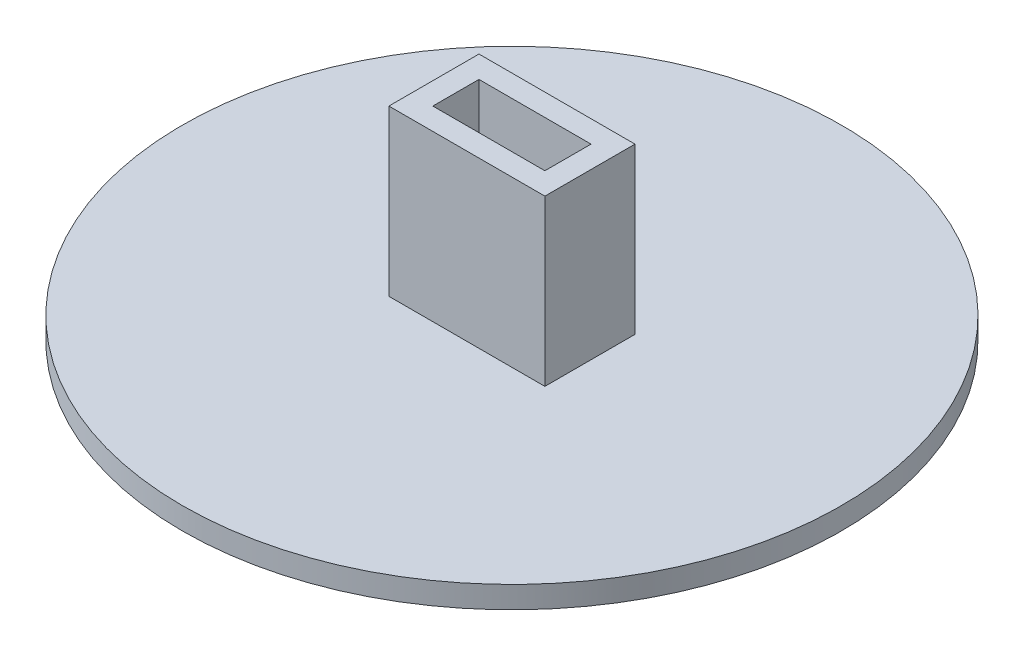
ISO-10303-21;
HEADER;
FILE_DESCRIPTION(('STEP AP214'),'2;1');
FILE_NAME('part.step','',(''),(''),'','','');
FILE_SCHEMA(('AUTOMOTIVE_DESIGN { 1 0 10303 214 1 1 1 1 }'));
ENDSEC;
DATA;
#1=APPLICATION_CONTEXT('core data for automotive mechanical design processes');
#2=APPLICATION_PROTOCOL_DEFINITION('international standard','automotive_design',2000,#1);
#3=PRODUCT_CONTEXT('',#1,'mechanical');
#4=PRODUCT('Part','Part','',(#3));
#5=PRODUCT_RELATED_PRODUCT_CATEGORY('part','',(#4));
#6=PRODUCT_DEFINITION_FORMATION('','',#4);
#7=PRODUCT_DEFINITION_CONTEXT('part definition',#1,'design');
#8=PRODUCT_DEFINITION('design','',#6,#7);
#9=PRODUCT_DEFINITION_SHAPE('','',#8);
#10=(LENGTH_UNIT() NAMED_UNIT(*) SI_UNIT(.MILLI.,.METRE.));
#11=(NAMED_UNIT(*) PLANE_ANGLE_UNIT() SI_UNIT($,.RADIAN.));
#12=(NAMED_UNIT(*) SI_UNIT($,.STERADIAN.) SOLID_ANGLE_UNIT());
#13=UNCERTAINTY_MEASURE_WITH_UNIT(LENGTH_MEASURE(1.E-05),#10,'distance_accuracy_value','');
#14=(GEOMETRIC_REPRESENTATION_CONTEXT(3) GLOBAL_UNCERTAINTY_ASSIGNED_CONTEXT((#13)) GLOBAL_UNIT_ASSIGNED_CONTEXT((#10,
#11,#12)) REPRESENTATION_CONTEXT('',''));
#15=CARTESIAN_POINT('',(0.,0.,0.));
#16=DIRECTION('',(0.,0.,1.));
#17=DIRECTION('',(1.,0.,0.));
#18=AXIS2_PLACEMENT_3D('',#15,#16,#17);
#19=CARTESIAN_POINT('',(0.,2.,0.));
#20=DIRECTION('',(0.,-1.,0.));
#21=DIRECTION('',(0.,0.,-1.));
#22=AXIS2_PLACEMENT_3D('',#19,#20,#21);
#23=CYLINDRICAL_SURFACE('',#22,30.);
#24=CARTESIAN_POINT('',(0.,2.,0.));
#25=DIRECTION('',(0.,1.,0.));
#26=DIRECTION('',(0.,0.,1.));
#27=AXIS2_PLACEMENT_3D('',#24,#25,#26);
#28=CIRCLE('',#27,30.);
#29=CARTESIAN_POINT('',(0.,2.,30.));
#30=VERTEX_POINT('',#29);
#31=EDGE_CURVE('E11',#30,#30,#28,.T.);
#32=ORIENTED_EDGE('',*,*,#31,.F.);
#33=EDGE_LOOP('',(#32));
#34=FACE_BOUND('',#33,.T.);
#35=CARTESIAN_POINT('',(0.,0.,0.));
#36=DIRECTION('',(0.,1.,0.));
#37=DIRECTION('',(0.,0.,1.));
#38=AXIS2_PLACEMENT_3D('',#35,#36,#37);
#39=CIRCLE('',#38,30.);
#40=CARTESIAN_POINT('',(0.,0.,30.));
#41=VERTEX_POINT('',#40);
#42=EDGE_CURVE('E35',#41,#41,#39,.T.);
#43=ORIENTED_EDGE('',*,*,#42,.T.);
#44=EDGE_LOOP('',(#43));
#45=FACE_BOUND('',#44,.T.);
#46=ADVANCED_FACE('F32',(#34,#45),#23,.T.);
#47=CARTESIAN_POINT('',(0.,2.,0.));
#48=DIRECTION('',(0.,1.,0.));
#49=DIRECTION('',(0.,0.,1.));
#50=AXIS2_PLACEMENT_3D('',#47,#48,#49);
#51=PLANE('',#50);
#52=DIRECTION('',(0.,0.,-1.));
#53=VECTOR('',#52,1.);
#54=CARTESIAN_POINT('',(7.1,2.,4.1));
#55=LINE('',#54,#53);
#56=CARTESIAN_POINT('',(7.1,2.,4.1));
#57=VERTEX_POINT('',#56);
#58=CARTESIAN_POINT('',(7.1,2.,-4.1));
#59=VERTEX_POINT('',#58);
#60=EDGE_CURVE('E46',#57,#59,#55,.T.);
#61=ORIENTED_EDGE('',*,*,#60,.F.);
#62=DIRECTION('',(1.,0.,0.));
#63=VECTOR('',#62,1.);
#64=CARTESIAN_POINT('',(-7.1,2.,4.1));
#65=LINE('',#64,#63);
#66=CARTESIAN_POINT('',(-7.1,2.,4.1));
#67=VERTEX_POINT('',#66);
#68=EDGE_CURVE('E50',#67,#57,#65,.T.);
#69=ORIENTED_EDGE('',*,*,#68,.F.);
#70=DIRECTION('',(0.,0.,1.));
#71=VECTOR('',#70,1.);
#72=CARTESIAN_POINT('',(-7.1,2.,4.1));
#73=LINE('',#72,#71);
#74=CARTESIAN_POINT('',(-7.1,2.,-4.1));
#75=VERTEX_POINT('',#74);
#76=EDGE_CURVE('E151',#75,#67,#73,.T.);
#77=ORIENTED_EDGE('',*,*,#76,.F.);
#78=DIRECTION('',(-1.,0.,0.));
#79=VECTOR('',#78,1.);
#80=CARTESIAN_POINT('',(-7.1,2.,-4.1));
#81=LINE('',#80,#79);
#82=EDGE_CURVE('E148',#59,#75,#81,.T.);
#83=ORIENTED_EDGE('',*,*,#82,.F.);
#84=EDGE_LOOP('',(#61,#69,#77,#83));
#85=FACE_BOUND('',#84,.T.);
#86=ORIENTED_EDGE('',*,*,#31,.T.);
#87=EDGE_LOOP('',(#86));
#88=FACE_BOUND('',#87,.T.);
#89=ADVANCED_FACE('F172',(#85,#88),#51,.T.);
#90=CARTESIAN_POINT('',(0.,0.,0.));
#91=DIRECTION('',(0.,1.,0.));
#92=DIRECTION('',(0.,0.,1.));
#93=AXIS2_PLACEMENT_3D('',#90,#91,#92);
#94=PLANE('',#93);
#95=ORIENTED_EDGE('',*,*,#42,.F.);
#96=EDGE_LOOP('',(#95));
#97=FACE_BOUND('',#96,.T.);
#98=ADVANCED_FACE('F170',(#97),#94,.F.);
#99=CARTESIAN_POINT('',(0.,17.,0.));
#100=DIRECTION('',(0.,-1.,0.));
#101=DIRECTION('',(0.,0.,-1.));
#102=AXIS2_PLACEMENT_3D('',#99,#100,#101);
#103=PLANE('',#102);
#104=DIRECTION('',(0.,0.,-1.));
#105=VECTOR('',#104,1.);
#106=CARTESIAN_POINT('',(7.1,17.,4.1));
#107=LINE('',#106,#105);
#108=CARTESIAN_POINT('',(7.1,17.,4.1));
#109=VERTEX_POINT('',#108);
#110=CARTESIAN_POINT('',(7.1,17.,-4.1));
#111=VERTEX_POINT('',#110);
#112=EDGE_CURVE('E137',#109,#111,#107,.T.);
#113=ORIENTED_EDGE('',*,*,#112,.T.);
#114=DIRECTION('',(-1.,0.,0.));
#115=VECTOR('',#114,1.);
#116=CARTESIAN_POINT('',(-7.1,17.,-4.1));
#117=LINE('',#116,#115);
#118=CARTESIAN_POINT('',(-7.1,17.,-4.1));
#119=VERTEX_POINT('',#118);
#120=EDGE_CURVE('E140',#111,#119,#117,.T.);
#121=ORIENTED_EDGE('',*,*,#120,.T.);
#122=DIRECTION('',(0.,0.,1.));
#123=VECTOR('',#122,1.);
#124=CARTESIAN_POINT('',(-7.1,17.,4.1));
#125=LINE('',#124,#123);
#126=CARTESIAN_POINT('',(-7.1,17.,4.1));
#127=VERTEX_POINT('',#126);
#128=EDGE_CURVE('E142',#119,#127,#125,.T.);
#129=ORIENTED_EDGE('',*,*,#128,.T.);
#130=DIRECTION('',(1.,0.,0.));
#131=VECTOR('',#130,1.);
#132=CARTESIAN_POINT('',(-7.1,17.,4.1));
#133=LINE('',#132,#131);
#134=EDGE_CURVE('E144',#127,#109,#133,.T.);
#135=ORIENTED_EDGE('',*,*,#134,.T.);
#136=EDGE_LOOP('',(#113,#121,#129,#135));
#137=FACE_BOUND('',#136,.T.);
#138=DIRECTION('',(0.,0.,-1.));
#139=VECTOR('',#138,1.);
#140=CARTESIAN_POINT('',(5.1,17.,2.1));
#141=LINE('',#140,#139);
#142=CARTESIAN_POINT('',(5.1,17.,2.1));
#143=VERTEX_POINT('',#142);
#144=CARTESIAN_POINT('',(5.1,17.,-2.1));
#145=VERTEX_POINT('',#144);
#146=EDGE_CURVE('E95',#143,#145,#141,.T.);
#147=ORIENTED_EDGE('',*,*,#146,.F.);
#148=DIRECTION('',(1.,0.,0.));
#149=VECTOR('',#148,1.);
#150=CARTESIAN_POINT('',(-5.1,17.,2.1));
#151=LINE('',#150,#149);
#152=CARTESIAN_POINT('',(-5.1,17.,2.1));
#153=VERTEX_POINT('',#152);
#154=EDGE_CURVE('E120',#153,#143,#151,.T.);
#155=ORIENTED_EDGE('',*,*,#154,.F.);
#156=DIRECTION('',(0.,0.,1.));
#157=VECTOR('',#156,1.);
#158=CARTESIAN_POINT('',(-5.1,17.,2.1));
#159=LINE('',#158,#157);
#160=CARTESIAN_POINT('',(-5.1,17.,-2.1));
#161=VERTEX_POINT('',#160);
#162=EDGE_CURVE('E118',#161,#153,#159,.T.);
#163=ORIENTED_EDGE('',*,*,#162,.F.);
#164=DIRECTION('',(-1.,0.,0.));
#165=VECTOR('',#164,1.);
#166=CARTESIAN_POINT('',(-5.1,17.,-2.1));
#167=LINE('',#166,#165);
#168=EDGE_CURVE('E105',#145,#161,#167,.T.);
#169=ORIENTED_EDGE('',*,*,#168,.F.);
#170=EDGE_LOOP('',(#147,#155,#163,#169));
#171=FACE_BOUND('',#170,.T.);
#172=ADVANCED_FACE('F116',(#137,#171),#103,.F.);
#173=CARTESIAN_POINT('',(7.1,17.,4.1));
#174=DIRECTION('',(-1.,0.,0.));
#175=DIRECTION('',(0.,0.,1.));
#176=AXIS2_PLACEMENT_3D('',#173,#174,#175);
#177=PLANE('',#176);
#178=ORIENTED_EDGE('',*,*,#60,.T.);
#179=DIRECTION('',(0.,-1.,0.));
#180=VECTOR('',#179,1.);
#181=CARTESIAN_POINT('',(7.1,17.,-4.1));
#182=LINE('',#181,#180);
#183=EDGE_CURVE('E162',#111,#59,#182,.T.);
#184=ORIENTED_EDGE('',*,*,#183,.F.);
#185=ORIENTED_EDGE('',*,*,#112,.F.);
#186=DIRECTION('',(0.,-1.,0.));
#187=VECTOR('',#186,1.);
#188=CARTESIAN_POINT('',(7.1,17.,4.1));
#189=LINE('',#188,#187);
#190=EDGE_CURVE('E146',#109,#57,#189,.T.);
#191=ORIENTED_EDGE('',*,*,#190,.T.);
#192=EDGE_LOOP('',(#178,#184,#185,#191));
#193=FACE_BOUND('',#192,.T.);
#194=ADVANCED_FACE('F177',(#193),#177,.F.);
#195=CARTESIAN_POINT('',(-7.1,17.,-4.1));
#196=DIRECTION('',(0.,0.,1.));
#197=DIRECTION('',(1.,0.,0.));
#198=AXIS2_PLACEMENT_3D('',#195,#196,#197);
#199=PLANE('',#198);
#200=ORIENTED_EDGE('',*,*,#82,.T.);
#201=DIRECTION('',(0.,-1.,0.));
#202=VECTOR('',#201,1.);
#203=CARTESIAN_POINT('',(-7.1,17.,-4.1));
#204=LINE('',#203,#202);
#205=EDGE_CURVE('E159',#119,#75,#204,.T.);
#206=ORIENTED_EDGE('',*,*,#205,.F.);
#207=ORIENTED_EDGE('',*,*,#120,.F.);
#208=ORIENTED_EDGE('',*,*,#183,.T.);
#209=EDGE_LOOP('',(#200,#206,#207,#208));
#210=FACE_BOUND('',#209,.T.);
#211=ADVANCED_FACE('F210',(#210),#199,.F.);
#212=CARTESIAN_POINT('',(-7.1,17.,4.1));
#213=DIRECTION('',(1.,0.,0.));
#214=DIRECTION('',(0.,0.,-1.));
#215=AXIS2_PLACEMENT_3D('',#212,#213,#214);
#216=PLANE('',#215);
#217=ORIENTED_EDGE('',*,*,#76,.T.);
#218=DIRECTION('',(0.,-1.,0.));
#219=VECTOR('',#218,1.);
#220=CARTESIAN_POINT('',(-7.1,17.,4.1));
#221=LINE('',#220,#219);
#222=EDGE_CURVE('E156',#127,#67,#221,.T.);
#223=ORIENTED_EDGE('',*,*,#222,.F.);
#224=ORIENTED_EDGE('',*,*,#128,.F.);
#225=ORIENTED_EDGE('',*,*,#205,.T.);
#226=EDGE_LOOP('',(#217,#223,#224,#225));
#227=FACE_BOUND('',#226,.T.);
#228=ADVANCED_FACE('F220',(#227),#216,.F.);
#229=CARTESIAN_POINT('',(-7.1,17.,4.1));
#230=DIRECTION('',(0.,0.,-1.));
#231=DIRECTION('',(-1.,0.,0.));
#232=AXIS2_PLACEMENT_3D('',#229,#230,#231);
#233=PLANE('',#232);
#234=ORIENTED_EDGE('',*,*,#68,.T.);
#235=ORIENTED_EDGE('',*,*,#190,.F.);
#236=ORIENTED_EDGE('',*,*,#134,.F.);
#237=ORIENTED_EDGE('',*,*,#222,.T.);
#238=EDGE_LOOP('',(#234,#235,#236,#237));
#239=FACE_BOUND('',#238,.T.);
#240=ADVANCED_FACE('F229',(#239),#233,.F.);
#241=CARTESIAN_POINT('',(5.1,17.,2.1));
#242=DIRECTION('',(-1.,0.,0.));
#243=DIRECTION('',(0.,0.,1.));
#244=AXIS2_PLACEMENT_3D('',#241,#242,#243);
#245=PLANE('',#244);
#246=DIRECTION('',(0.,0.,-1.));
#247=VECTOR('',#246,1.);
#248=CARTESIAN_POINT('',(5.1,2.,2.1));
#249=LINE('',#248,#247);
#250=CARTESIAN_POINT('',(5.1,2.,2.1));
#251=VERTEX_POINT('',#250);
#252=CARTESIAN_POINT('',(5.1,2.,-2.1));
#253=VERTEX_POINT('',#252);
#254=EDGE_CURVE('E124',#251,#253,#249,.T.);
#255=ORIENTED_EDGE('',*,*,#254,.F.);
#256=DIRECTION('',(0.,-1.,0.));
#257=VECTOR('',#256,1.);
#258=CARTESIAN_POINT('',(5.1,17.,2.1));
#259=LINE('',#258,#257);
#260=EDGE_CURVE('E101',#143,#251,#259,.T.);
#261=ORIENTED_EDGE('',*,*,#260,.F.);
#262=ORIENTED_EDGE('',*,*,#146,.T.);
#263=DIRECTION('',(0.,-1.,0.));
#264=VECTOR('',#263,1.);
#265=CARTESIAN_POINT('',(5.1,17.,-2.1));
#266=LINE('',#265,#264);
#267=EDGE_CURVE('E98',#145,#253,#266,.T.);
#268=ORIENTED_EDGE('',*,*,#267,.T.);
#269=EDGE_LOOP('',(#255,#261,#262,#268));
#270=FACE_BOUND('',#269,.T.);
#271=ADVANCED_FACE('F97',(#270),#245,.T.);
#272=CARTESIAN_POINT('',(-5.1,17.,-2.1));
#273=DIRECTION('',(0.,0.,1.));
#274=DIRECTION('',(1.,0.,0.));
#275=AXIS2_PLACEMENT_3D('',#272,#273,#274);
#276=PLANE('',#275);
#277=DIRECTION('',(-1.,0.,0.));
#278=VECTOR('',#277,1.);
#279=CARTESIAN_POINT('',(-5.1,2.,-2.1));
#280=LINE('',#279,#278);
#281=CARTESIAN_POINT('',(-5.1,2.,-2.1));
#282=VERTEX_POINT('',#281);
#283=EDGE_CURVE('E112',#253,#282,#280,.T.);
#284=ORIENTED_EDGE('',*,*,#283,.F.);
#285=ORIENTED_EDGE('',*,*,#267,.F.);
#286=ORIENTED_EDGE('',*,*,#168,.T.);
#287=DIRECTION('',(0.,-1.,0.));
#288=VECTOR('',#287,1.);
#289=CARTESIAN_POINT('',(-5.1,17.,-2.1));
#290=LINE('',#289,#288);
#291=EDGE_CURVE('E113',#161,#282,#290,.T.);
#292=ORIENTED_EDGE('',*,*,#291,.T.);
#293=EDGE_LOOP('',(#284,#285,#286,#292));
#294=FACE_BOUND('',#293,.T.);
#295=ADVANCED_FACE('F109',(#294),#276,.T.);
#296=CARTESIAN_POINT('',(-5.1,17.,2.1));
#297=DIRECTION('',(1.,0.,0.));
#298=DIRECTION('',(0.,0.,-1.));
#299=AXIS2_PLACEMENT_3D('',#296,#297,#298);
#300=PLANE('',#299);
#301=DIRECTION('',(0.,0.,1.));
#302=VECTOR('',#301,1.);
#303=CARTESIAN_POINT('',(-5.1,2.,2.1));
#304=LINE('',#303,#302);
#305=CARTESIAN_POINT('',(-5.1,2.,2.1));
#306=VERTEX_POINT('',#305);
#307=EDGE_CURVE('E127',#282,#306,#304,.T.);
#308=ORIENTED_EDGE('',*,*,#307,.F.);
#309=ORIENTED_EDGE('',*,*,#291,.F.);
#310=ORIENTED_EDGE('',*,*,#162,.T.);
#311=DIRECTION('',(0.,-1.,0.));
#312=VECTOR('',#311,1.);
#313=CARTESIAN_POINT('',(-5.1,17.,2.1));
#314=LINE('',#313,#312);
#315=EDGE_CURVE('E133',#153,#306,#314,.T.);
#316=ORIENTED_EDGE('',*,*,#315,.T.);
#317=EDGE_LOOP('',(#308,#309,#310,#316));
#318=FACE_BOUND('',#317,.T.);
#319=ADVANCED_FACE('F256',(#318),#300,.T.);
#320=CARTESIAN_POINT('',(-5.1,17.,2.1));
#321=DIRECTION('',(0.,0.,-1.));
#322=DIRECTION('',(-1.,0.,0.));
#323=AXIS2_PLACEMENT_3D('',#320,#321,#322);
#324=PLANE('',#323);
#325=DIRECTION('',(1.,0.,0.));
#326=VECTOR('',#325,1.);
#327=CARTESIAN_POINT('',(-5.1,2.,2.1));
#328=LINE('',#327,#326);
#329=EDGE_CURVE('E106',#306,#251,#328,.T.);
#330=ORIENTED_EDGE('',*,*,#329,.F.);
#331=ORIENTED_EDGE('',*,*,#315,.F.);
#332=ORIENTED_EDGE('',*,*,#154,.T.);
#333=ORIENTED_EDGE('',*,*,#260,.T.);
#334=EDGE_LOOP('',(#330,#331,#332,#333));
#335=FACE_BOUND('',#334,.T.);
#336=ADVANCED_FACE('F265',(#335),#324,.T.);
#337=ORIENTED_EDGE('',*,*,#307,.T.);
#338=ORIENTED_EDGE('',*,*,#329,.T.);
#339=ORIENTED_EDGE('',*,*,#254,.T.);
#340=ORIENTED_EDGE('',*,*,#283,.T.);
#341=EDGE_LOOP('',(#337,#338,#339,#340));
#342=FACE_BOUND('',#341,.T.);
#343=ADVANCED_FACE('F181',(#342),#51,.T.);
#344=CLOSED_SHELL('',(#46,#89,#98,#172,#194,#211,#228,#240,#271,#295,#319,#336,#343));
#345=MANIFOLD_SOLID_BREP('B2',#344);
#346=ADVANCED_BREP_SHAPE_REPRESENTATION('',(#18,#345),#14);
#347=SHAPE_DEFINITION_REPRESENTATION(#9,#346);
ENDSEC;
END-ISO-10303-21;
